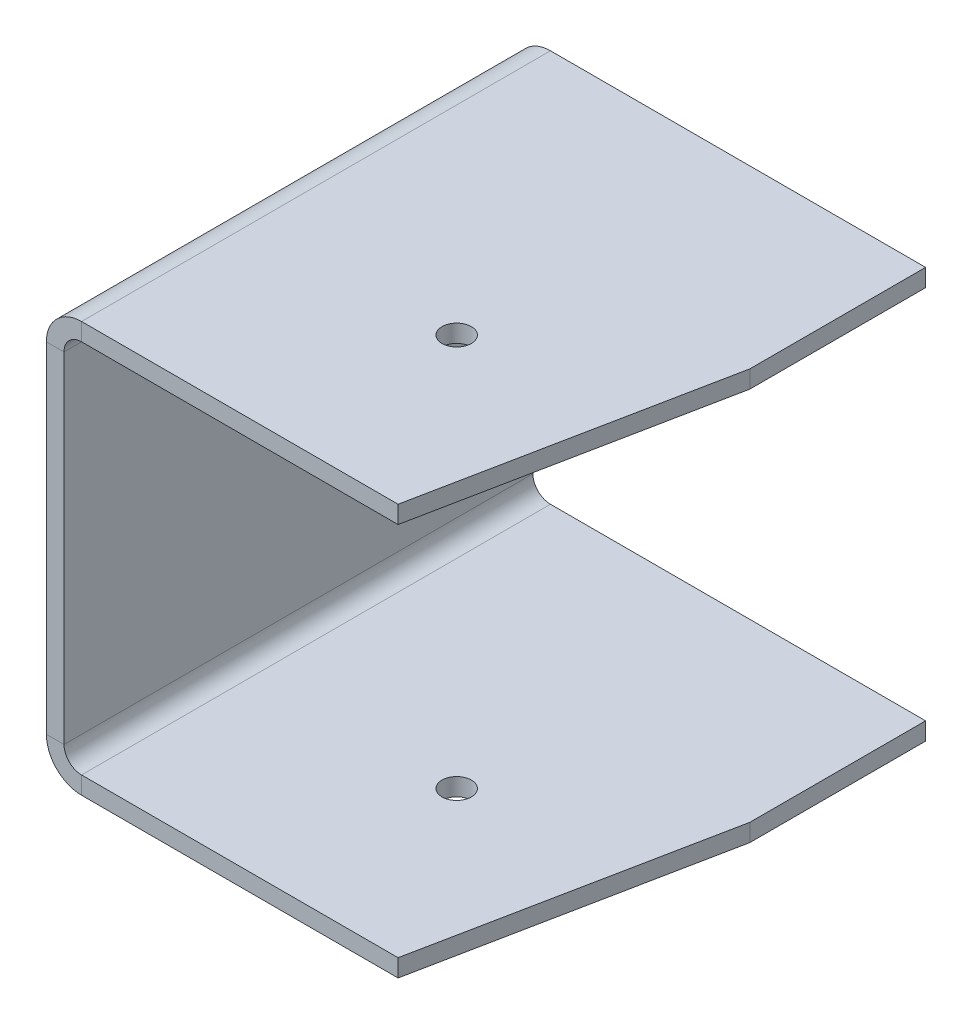
ISO-10303-21;
HEADER;
FILE_DESCRIPTION(('STEP AP214'),'2;1');
FILE_NAME('part.step','',(''),(''),'','','');
FILE_SCHEMA(('AUTOMOTIVE_DESIGN { 1 0 10303 214 1 1 1 1 }'));
ENDSEC;
DATA;
#1=APPLICATION_CONTEXT('core data for automotive mechanical design processes');
#2=APPLICATION_PROTOCOL_DEFINITION('international standard','automotive_design',2000,#1);
#3=PRODUCT_CONTEXT('',#1,'mechanical');
#4=PRODUCT('Part','Part','',(#3));
#5=PRODUCT_RELATED_PRODUCT_CATEGORY('part','',(#4));
#6=PRODUCT_DEFINITION_FORMATION('','',#4);
#7=PRODUCT_DEFINITION_CONTEXT('part definition',#1,'design');
#8=PRODUCT_DEFINITION('design','',#6,#7);
#9=PRODUCT_DEFINITION_SHAPE('','',#8);
#10=(LENGTH_UNIT() NAMED_UNIT(*) SI_UNIT(.MILLI.,.METRE.));
#11=(NAMED_UNIT(*) PLANE_ANGLE_UNIT() SI_UNIT($,.RADIAN.));
#12=(NAMED_UNIT(*) SI_UNIT($,.STERADIAN.) SOLID_ANGLE_UNIT());
#13=UNCERTAINTY_MEASURE_WITH_UNIT(LENGTH_MEASURE(1.E-05),#10,'distance_accuracy_value','');
#14=(GEOMETRIC_REPRESENTATION_CONTEXT(3) GLOBAL_UNCERTAINTY_ASSIGNED_CONTEXT((#13)) GLOBAL_UNIT_ASSIGNED_CONTEXT((#10,
#11,#12)) REPRESENTATION_CONTEXT('',''));
#15=CARTESIAN_POINT('',(0.,0.,0.));
#16=DIRECTION('',(0.,0.,1.));
#17=DIRECTION('',(1.,0.,0.));
#18=AXIS2_PLACEMENT_3D('',#15,#16,#17);
#19=CARTESIAN_POINT('',(-70.,6.,80.));
#20=DIRECTION('',(0.,0.,1.));
#21=DIRECTION('',(1.,0.,0.));
#22=AXIS2_PLACEMENT_3D('',#19,#20,#21);
#23=PLANE('',#22);
#24=DIRECTION('',(1.,0.,0.));
#25=VECTOR('',#24,1.);
#26=CARTESIAN_POINT('',(-70.,6.,80.));
#27=LINE('',#26,#25);
#28=CARTESIAN_POINT('',(-70.,6.,80.));
#29=VERTEX_POINT('',#28);
#30=CARTESIAN_POINT('',(-67.,6.,80.));
#31=VERTEX_POINT('',#30);
#32=EDGE_CURVE('E49',#29,#31,#27,.T.);
#33=ORIENTED_EDGE('',*,*,#32,.F.);
#34=CARTESIAN_POINT('',(-64.,6.,80.));
#35=DIRECTION('',(0.,0.,1.));
#36=DIRECTION('',(1.,0.,0.));
#37=AXIS2_PLACEMENT_3D('',#34,#35,#36);
#38=CIRCLE('',#37,6.);
#39=CARTESIAN_POINT('',(-64.,0.,80.));
#40=VERTEX_POINT('',#39);
#41=EDGE_CURVE('E161',#40,#29,#38,.F.);
#42=ORIENTED_EDGE('',*,*,#41,.F.);
#43=DIRECTION('',(0.,-1.,0.));
#44=VECTOR('',#43,1.);
#45=CARTESIAN_POINT('',(-64.,3.,80.));
#46=LINE('',#45,#44);
#47=CARTESIAN_POINT('',(-64.,3.,80.));
#48=VERTEX_POINT('',#47);
#49=EDGE_CURVE('E158',#48,#40,#46,.T.);
#50=ORIENTED_EDGE('',*,*,#49,.F.);
#51=CARTESIAN_POINT('',(-64.,6.,80.));
#52=DIRECTION('',(0.,0.,1.));
#53=DIRECTION('',(1.,0.,0.));
#54=AXIS2_PLACEMENT_3D('',#51,#52,#53);
#55=CIRCLE('',#54,3.);
#56=EDGE_CURVE('E163',#48,#31,#55,.F.);
#57=ORIENTED_EDGE('',*,*,#56,.T.);
#58=EDGE_LOOP('',(#33,#42,#50,#57));
#59=FACE_BOUND('',#58,.T.);
#60=ADVANCED_FACE('F41',(#59),#23,.T.);
#61=CARTESIAN_POINT('',(-64.,3.,80.));
#62=DIRECTION('',(0.,0.,1.));
#63=DIRECTION('',(1.,0.,0.));
#64=AXIS2_PLACEMENT_3D('',#61,#62,#63);
#65=PLANE('',#64);
#66=DIRECTION('',(0.,1.,0.));
#67=VECTOR('',#66,1.);
#68=CARTESIAN_POINT('',(-70.,0.,80.));
#69=LINE('',#68,#67);
#70=CARTESIAN_POINT('',(-70.,64.,80.));
#71=VERTEX_POINT('',#70);
#72=EDGE_CURVE('E166',#29,#71,#69,.T.);
#73=ORIENTED_EDGE('',*,*,#72,.F.);
#74=ORIENTED_EDGE('',*,*,#32,.T.);
#75=DIRECTION('',(0.,1.,0.));
#76=VECTOR('',#75,1.);
#77=CARTESIAN_POINT('',(-67.,0.,80.));
#78=LINE('',#77,#76);
#79=CARTESIAN_POINT('',(-67.,64.,80.));
#80=VERTEX_POINT('',#79);
#81=EDGE_CURVE('E172',#31,#80,#78,.T.);
#82=ORIENTED_EDGE('',*,*,#81,.T.);
#83=DIRECTION('',(-1.,0.,0.));
#84=VECTOR('',#83,1.);
#85=CARTESIAN_POINT('',(-67.,64.,80.));
#86=LINE('',#85,#84);
#87=EDGE_CURVE('E250',#80,#71,#86,.T.);
#88=ORIENTED_EDGE('',*,*,#87,.T.);
#89=EDGE_LOOP('',(#73,#74,#82,#88));
#90=FACE_BOUND('',#89,.T.);
#91=ADVANCED_FACE('F261',(#90),#65,.T.);
#92=CARTESIAN_POINT('',(-64.,0.,0.));
#93=DIRECTION('',(0.,0.,-1.));
#94=DIRECTION('',(-1.,0.,0.));
#95=AXIS2_PLACEMENT_3D('',#92,#93,#94);
#96=PLANE('',#95);
#97=DIRECTION('',(0.,1.,0.));
#98=VECTOR('',#97,1.);
#99=CARTESIAN_POINT('',(-64.,0.,0.));
#100=LINE('',#99,#98);
#101=CARTESIAN_POINT('',(-64.,0.,0.));
#102=VERTEX_POINT('',#101);
#103=CARTESIAN_POINT('',(-64.,3.,0.));
#104=VERTEX_POINT('',#103);
#105=EDGE_CURVE('E256',#102,#104,#100,.T.);
#106=ORIENTED_EDGE('',*,*,#105,.F.);
#107=CARTESIAN_POINT('',(-64.,6.,0.));
#108=DIRECTION('',(0.,0.,1.));
#109=DIRECTION('',(1.,0.,0.));
#110=AXIS2_PLACEMENT_3D('',#107,#108,#109);
#111=CIRCLE('',#110,6.);
#112=CARTESIAN_POINT('',(-70.,6.,0.));
#113=VERTEX_POINT('',#112);
#114=EDGE_CURVE('E195',#102,#113,#111,.F.);
#115=ORIENTED_EDGE('',*,*,#114,.T.);
#116=DIRECTION('',(-1.,0.,0.));
#117=VECTOR('',#116,1.);
#118=CARTESIAN_POINT('',(-67.,6.,0.));
#119=LINE('',#118,#117);
#120=CARTESIAN_POINT('',(-67.,6.,0.));
#121=VERTEX_POINT('',#120);
#122=EDGE_CURVE('E254',#121,#113,#119,.T.);
#123=ORIENTED_EDGE('',*,*,#122,.F.);
#124=CARTESIAN_POINT('',(-64.,6.,0.));
#125=DIRECTION('',(0.,0.,1.));
#126=DIRECTION('',(1.,0.,0.));
#127=AXIS2_PLACEMENT_3D('',#124,#125,#126);
#128=CIRCLE('',#127,3.);
#129=EDGE_CURVE('E207',#104,#121,#128,.F.);
#130=ORIENTED_EDGE('',*,*,#129,.F.);
#131=EDGE_LOOP('',(#106,#115,#123,#130));
#132=FACE_BOUND('',#131,.T.);
#133=ADVANCED_FACE('F341',(#132),#96,.T.);
#134=CARTESIAN_POINT('',(-67.,6.,0.));
#135=DIRECTION('',(0.,0.,-1.));
#136=DIRECTION('',(-1.,0.,0.));
#137=AXIS2_PLACEMENT_3D('',#134,#135,#136);
#138=PLANE('',#137);
#139=DIRECTION('',(-1.,0.,0.));
#140=VECTOR('',#139,1.);
#141=CARTESIAN_POINT('',(0.,0.,0.));
#142=LINE('',#141,#140);
#143=CARTESIAN_POINT('',(0.,0.,0.));
#144=VERTEX_POINT('',#143);
#145=EDGE_CURVE('E198',#144,#102,#142,.T.);
#146=ORIENTED_EDGE('',*,*,#145,.T.);
#147=ORIENTED_EDGE('',*,*,#105,.T.);
#148=DIRECTION('',(1.,0.,0.));
#149=VECTOR('',#148,1.);
#150=CARTESIAN_POINT('',(0.,3.,0.));
#151=LINE('',#150,#149);
#152=CARTESIAN_POINT('',(0.,3.,0.));
#153=VERTEX_POINT('',#152);
#154=EDGE_CURVE('E204',#153,#104,#151,.F.);
#155=ORIENTED_EDGE('',*,*,#154,.F.);
#156=DIRECTION('',(0.,-1.,0.));
#157=VECTOR('',#156,1.);
#158=CARTESIAN_POINT('',(0.,3.,0.));
#159=LINE('',#158,#157);
#160=EDGE_CURVE('E201',#153,#144,#159,.T.);
#161=ORIENTED_EDGE('',*,*,#160,.T.);
#162=EDGE_LOOP('',(#146,#147,#155,#161));
#163=FACE_BOUND('',#162,.T.);
#164=ADVANCED_FACE('F345',(#163),#138,.T.);
#165=CARTESIAN_POINT('',(-64.,70.,80.));
#166=DIRECTION('',(0.,0.,1.));
#167=DIRECTION('',(1.,0.,0.));
#168=AXIS2_PLACEMENT_3D('',#165,#166,#167);
#169=PLANE('',#168);
#170=DIRECTION('',(0.,-1.,0.));
#171=VECTOR('',#170,1.);
#172=CARTESIAN_POINT('',(-64.,70.,80.));
#173=LINE('',#172,#171);
#174=CARTESIAN_POINT('',(-64.,70.,80.));
#175=VERTEX_POINT('',#174);
#176=CARTESIAN_POINT('',(-64.,67.,80.));
#177=VERTEX_POINT('',#176);
#178=EDGE_CURVE('E252',#175,#177,#173,.T.);
#179=ORIENTED_EDGE('',*,*,#178,.F.);
#180=CARTESIAN_POINT('',(-64.,64.,80.));
#181=DIRECTION('',(0.,0.,1.));
#182=DIRECTION('',(1.,0.,0.));
#183=AXIS2_PLACEMENT_3D('',#180,#181,#182);
#184=CIRCLE('',#183,6.);
#185=EDGE_CURVE('E288',#71,#175,#184,.F.);
#186=ORIENTED_EDGE('',*,*,#185,.F.);
#187=ORIENTED_EDGE('',*,*,#87,.F.);
#188=CARTESIAN_POINT('',(-64.,64.,80.));
#189=DIRECTION('',(0.,0.,1.));
#190=DIRECTION('',(1.,0.,0.));
#191=AXIS2_PLACEMENT_3D('',#188,#189,#190);
#192=CIRCLE('',#191,3.);
#193=EDGE_CURVE('E175',#80,#177,#192,.F.);
#194=ORIENTED_EDGE('',*,*,#193,.T.);
#195=EDGE_LOOP('',(#179,#186,#187,#194));
#196=FACE_BOUND('',#195,.T.);
#197=ADVANCED_FACE('F284',(#196),#169,.T.);
#198=CARTESIAN_POINT('',(-67.,64.,80.));
#199=DIRECTION('',(0.,0.,1.));
#200=DIRECTION('',(1.,0.,0.));
#201=AXIS2_PLACEMENT_3D('',#198,#199,#200);
#202=PLANE('',#201);
#203=DIRECTION('',(0.,-1.,0.));
#204=VECTOR('',#203,1.);
#205=CARTESIAN_POINT('',(-10.,158.,80.));
#206=LINE('',#205,#204);
#207=CARTESIAN_POINT('',(-10.,70.,80.));
#208=VERTEX_POINT('',#207);
#209=CARTESIAN_POINT('',(-10.,67.,80.));
#210=VERTEX_POINT('',#209);
#211=EDGE_CURVE('E153',#208,#210,#206,.T.);
#212=ORIENTED_EDGE('',*,*,#211,.F.);
#213=DIRECTION('',(1.,0.,0.));
#214=VECTOR('',#213,1.);
#215=CARTESIAN_POINT('',(-70.,70.,80.));
#216=LINE('',#215,#214);
#217=EDGE_CURVE('E296',#175,#208,#216,.T.);
#218=ORIENTED_EDGE('',*,*,#217,.F.);
#219=ORIENTED_EDGE('',*,*,#178,.T.);
#220=DIRECTION('',(1.,0.,0.));
#221=VECTOR('',#220,1.);
#222=CARTESIAN_POINT('',(-70.,67.,80.));
#223=LINE('',#222,#221);
#224=EDGE_CURVE('E216',#177,#210,#223,.T.);
#225=ORIENTED_EDGE('',*,*,#224,.T.);
#226=EDGE_LOOP('',(#212,#218,#219,#225));
#227=FACE_BOUND('',#226,.T.);
#228=ADVANCED_FACE('F354',(#227),#202,.T.);
#229=CARTESIAN_POINT('',(-70.,64.,0.));
#230=DIRECTION('',(0.,0.,-1.));
#231=DIRECTION('',(-1.,0.,0.));
#232=AXIS2_PLACEMENT_3D('',#229,#230,#231);
#233=PLANE('',#232);
#234=DIRECTION('',(1.,0.,0.));
#235=VECTOR('',#234,1.);
#236=CARTESIAN_POINT('',(-70.,64.,0.));
#237=LINE('',#236,#235);
#238=CARTESIAN_POINT('',(-70.,64.,0.));
#239=VERTEX_POINT('',#238);
#240=CARTESIAN_POINT('',(-67.,64.,0.));
#241=VERTEX_POINT('',#240);
#242=EDGE_CURVE('E248',#239,#241,#237,.T.);
#243=ORIENTED_EDGE('',*,*,#242,.F.);
#244=CARTESIAN_POINT('',(-64.,64.,0.));
#245=DIRECTION('',(0.,0.,1.));
#246=DIRECTION('',(1.,0.,0.));
#247=AXIS2_PLACEMENT_3D('',#244,#245,#246);
#248=CIRCLE('',#247,6.);
#249=CARTESIAN_POINT('',(-64.,70.,0.));
#250=VERTEX_POINT('',#249);
#251=EDGE_CURVE('E189',#239,#250,#248,.F.);
#252=ORIENTED_EDGE('',*,*,#251,.T.);
#253=DIRECTION('',(0.,1.,0.));
#254=VECTOR('',#253,1.);
#255=CARTESIAN_POINT('',(-64.,67.,0.));
#256=LINE('',#255,#254);
#257=CARTESIAN_POINT('',(-64.,67.,0.));
#258=VERTEX_POINT('',#257);
#259=EDGE_CURVE('E246',#258,#250,#256,.T.);
#260=ORIENTED_EDGE('',*,*,#259,.F.);
#261=CARTESIAN_POINT('',(-64.,64.,0.));
#262=DIRECTION('',(0.,0.,1.));
#263=DIRECTION('',(1.,0.,0.));
#264=AXIS2_PLACEMENT_3D('',#261,#262,#263);
#265=CIRCLE('',#264,3.);
#266=EDGE_CURVE('E213',#241,#258,#265,.F.);
#267=ORIENTED_EDGE('',*,*,#266,.F.);
#268=EDGE_LOOP('',(#243,#252,#260,#267));
#269=FACE_BOUND('',#268,.T.);
#270=ADVANCED_FACE('F357',(#269),#233,.T.);
#271=CARTESIAN_POINT('',(-64.,67.,0.));
#272=DIRECTION('',(0.,0.,-1.));
#273=DIRECTION('',(-1.,0.,0.));
#274=AXIS2_PLACEMENT_3D('',#271,#272,#273);
#275=PLANE('',#274);
#276=DIRECTION('',(0.,1.,0.));
#277=VECTOR('',#276,1.);
#278=CARTESIAN_POINT('',(-70.,0.,0.));
#279=LINE('',#278,#277);
#280=EDGE_CURVE('E192',#113,#239,#279,.T.);
#281=ORIENTED_EDGE('',*,*,#280,.T.);
#282=ORIENTED_EDGE('',*,*,#242,.T.);
#283=DIRECTION('',(0.,1.,0.));
#284=VECTOR('',#283,1.);
#285=CARTESIAN_POINT('',(-67.,0.,0.));
#286=LINE('',#285,#284);
#287=EDGE_CURVE('E210',#121,#241,#286,.T.);
#288=ORIENTED_EDGE('',*,*,#287,.F.);
#289=ORIENTED_EDGE('',*,*,#122,.T.);
#290=EDGE_LOOP('',(#281,#282,#288,#289));
#291=FACE_BOUND('',#290,.T.);
#292=ADVANCED_FACE('F361',(#291),#275,.T.);
#293=CARTESIAN_POINT('',(-70.,67.,80.));
#294=DIRECTION('',(0.,1.,0.));
#295=DIRECTION('',(0.,0.,1.));
#296=AXIS2_PLACEMENT_3D('',#293,#294,#295);
#297=PLANE('',#296);
#298=CARTESIAN_POINT('',(-30.,67.,50.));
#299=DIRECTION('',(0.,1.,0.));
#300=DIRECTION('',(0.,0.,1.));
#301=AXIS2_PLACEMENT_3D('',#298,#299,#300);
#302=CIRCLE('',#301,2.5);
#303=CARTESIAN_POINT('',(-30.,67.,52.5));
#304=VERTEX_POINT('',#303);
#305=EDGE_CURVE('E154',#304,#304,#302,.T.);
#306=ORIENTED_EDGE('',*,*,#305,.T.);
#307=EDGE_LOOP('',(#306));
#308=FACE_BOUND('',#307,.T.);
#309=DIRECTION('',(0.,0.,-1.));
#310=VECTOR('',#309,1.);
#311=CARTESIAN_POINT('',(0.,67.,80.));
#312=LINE('',#311,#310);
#313=CARTESIAN_POINT('',(0.,67.,30.));
#314=VERTEX_POINT('',#313);
#315=CARTESIAN_POINT('',(0.,67.,0.));
#316=VERTEX_POINT('',#315);
#317=EDGE_CURVE('E244',#314,#316,#312,.T.);
#318=ORIENTED_EDGE('',*,*,#317,.F.);
#319=DIRECTION('',(-0.196116135138184,0.,0.98058067569092));
#320=VECTOR('',#319,1.);
#321=CARTESIAN_POINT('',(-12.3076923076923,67.,91.5384615384615));
#322=LINE('',#321,#320);
#323=EDGE_CURVE('E183',#314,#210,#322,.T.);
#324=ORIENTED_EDGE('',*,*,#323,.T.);
#325=ORIENTED_EDGE('',*,*,#224,.F.);
#326=DIRECTION('',(0.,0.,-1.));
#327=VECTOR('',#326,1.);
#328=CARTESIAN_POINT('',(-64.,67.,80.));
#329=LINE('',#328,#327);
#330=EDGE_CURVE('E178',#177,#258,#329,.T.);
#331=ORIENTED_EDGE('',*,*,#330,.T.);
#332=DIRECTION('',(1.,0.,0.));
#333=VECTOR('',#332,1.);
#334=CARTESIAN_POINT('',(-70.,67.,0.));
#335=LINE('',#334,#333);
#336=EDGE_CURVE('E179',#258,#316,#335,.T.);
#337=ORIENTED_EDGE('',*,*,#336,.T.);
#338=EDGE_LOOP('',(#318,#324,#325,#331,#337));
#339=FACE_BOUND('',#338,.T.);
#340=ADVANCED_FACE('F365',(#308,#339),#297,.F.);
#341=CARTESIAN_POINT('',(0.,70.,80.));
#342=DIRECTION('',(1.,0.,0.));
#343=DIRECTION('',(0.,0.,-1.));
#344=AXIS2_PLACEMENT_3D('',#341,#342,#343);
#345=PLANE('',#344);
#346=DIRECTION('',(0.,-1.,0.));
#347=VECTOR('',#346,1.);
#348=CARTESIAN_POINT('',(0.,158.,30.));
#349=LINE('',#348,#347);
#350=CARTESIAN_POINT('',(0.,70.,29.9999999999999));
#351=VERTEX_POINT('',#350);
#352=EDGE_CURVE('E56',#351,#314,#349,.T.);
#353=ORIENTED_EDGE('',*,*,#352,.T.);
#354=ORIENTED_EDGE('',*,*,#317,.T.);
#355=DIRECTION('',(0.,-1.,0.));
#356=VECTOR('',#355,1.);
#357=CARTESIAN_POINT('',(0.,70.,0.));
#358=LINE('',#357,#356);
#359=CARTESIAN_POINT('',(0.,70.,0.));
#360=VERTEX_POINT('',#359);
#361=EDGE_CURVE('E182',#360,#316,#358,.T.);
#362=ORIENTED_EDGE('',*,*,#361,.F.);
#363=DIRECTION('',(0.,0.,-1.));
#364=VECTOR('',#363,1.);
#365=CARTESIAN_POINT('',(0.,70.,80.));
#366=LINE('',#365,#364);
#367=EDGE_CURVE('E242',#351,#360,#366,.T.);
#368=ORIENTED_EDGE('',*,*,#367,.F.);
#369=EDGE_LOOP('',(#353,#354,#362,#368));
#370=FACE_BOUND('',#369,.T.);
#371=ADVANCED_FACE('F369',(#370),#345,.T.);
#372=CARTESIAN_POINT('',(-70.,70.,80.));
#373=DIRECTION('',(0.,1.,0.));
#374=DIRECTION('',(0.,0.,1.));
#375=AXIS2_PLACEMENT_3D('',#372,#373,#374);
#376=PLANE('',#375);
#377=CARTESIAN_POINT('',(-30.,70.,50.));
#378=DIRECTION('',(0.,1.,0.));
#379=DIRECTION('',(0.,0.,1.));
#380=AXIS2_PLACEMENT_3D('',#377,#378,#379);
#381=CIRCLE('',#380,2.5);
#382=CARTESIAN_POINT('',(-30.,70.,52.5));
#383=VERTEX_POINT('',#382);
#384=EDGE_CURVE('E313',#383,#383,#381,.T.);
#385=ORIENTED_EDGE('',*,*,#384,.F.);
#386=EDGE_LOOP('',(#385));
#387=FACE_BOUND('',#386,.T.);
#388=DIRECTION('',(-0.196116135138184,0.,0.98058067569092));
#389=VECTOR('',#388,1.);
#390=CARTESIAN_POINT('',(-12.3076923076923,70.,91.5384615384615));
#391=LINE('',#390,#389);
#392=EDGE_CURVE('E305',#351,#208,#391,.T.);
#393=ORIENTED_EDGE('',*,*,#392,.F.);
#394=ORIENTED_EDGE('',*,*,#367,.T.);
#395=DIRECTION('',(1.,0.,0.));
#396=VECTOR('',#395,1.);
#397=CARTESIAN_POINT('',(-70.,70.,0.));
#398=LINE('',#397,#396);
#399=EDGE_CURVE('E186',#250,#360,#398,.T.);
#400=ORIENTED_EDGE('',*,*,#399,.F.);
#401=DIRECTION('',(0.,0.,-1.));
#402=VECTOR('',#401,1.);
#403=CARTESIAN_POINT('',(-64.,70.,80.));
#404=LINE('',#403,#402);
#405=EDGE_CURVE('E239',#175,#250,#404,.T.);
#406=ORIENTED_EDGE('',*,*,#405,.F.);
#407=ORIENTED_EDGE('',*,*,#217,.T.);
#408=EDGE_LOOP('',(#393,#394,#400,#406,#407));
#409=FACE_BOUND('',#408,.T.);
#410=ADVANCED_FACE('F373',(#387,#409),#376,.T.);
#411=CARTESIAN_POINT('',(-64.,64.,80.));
#412=DIRECTION('',(0.,0.,-1.));
#413=DIRECTION('',(-1.,0.,0.));
#414=AXIS2_PLACEMENT_3D('',#411,#412,#413);
#415=CYLINDRICAL_SURFACE('',#414,6.);
#416=ORIENTED_EDGE('',*,*,#251,.F.);
#417=DIRECTION('',(0.,0.,-1.));
#418=VECTOR('',#417,1.);
#419=CARTESIAN_POINT('',(-70.,64.,80.));
#420=LINE('',#419,#418);
#421=EDGE_CURVE('E236',#71,#239,#420,.T.);
#422=ORIENTED_EDGE('',*,*,#421,.F.);
#423=ORIENTED_EDGE('',*,*,#185,.T.);
#424=ORIENTED_EDGE('',*,*,#405,.T.);
#425=EDGE_LOOP('',(#416,#422,#423,#424));
#426=FACE_BOUND('',#425,.T.);
#427=ADVANCED_FACE('F292',(#426),#415,.T.);
#428=CARTESIAN_POINT('',(-70.,0.,80.));
#429=DIRECTION('',(-1.,0.,0.));
#430=DIRECTION('',(0.,0.,1.));
#431=AXIS2_PLACEMENT_3D('',#428,#429,#430);
#432=PLANE('',#431);
#433=ORIENTED_EDGE('',*,*,#280,.F.);
#434=DIRECTION('',(0.,0.,-1.));
#435=VECTOR('',#434,1.);
#436=CARTESIAN_POINT('',(-70.,6.,80.));
#437=LINE('',#436,#435);
#438=EDGE_CURVE('E233',#29,#113,#437,.T.);
#439=ORIENTED_EDGE('',*,*,#438,.F.);
#440=ORIENTED_EDGE('',*,*,#72,.T.);
#441=ORIENTED_EDGE('',*,*,#421,.T.);
#442=EDGE_LOOP('',(#433,#439,#440,#441));
#443=FACE_BOUND('',#442,.T.);
#444=ADVANCED_FACE('F295',(#443),#432,.T.);
#445=CARTESIAN_POINT('',(-64.,6.,80.));
#446=DIRECTION('',(0.,0.,-1.));
#447=DIRECTION('',(-1.,0.,0.));
#448=AXIS2_PLACEMENT_3D('',#445,#446,#447);
#449=CYLINDRICAL_SURFACE('',#448,6.);
#450=ORIENTED_EDGE('',*,*,#114,.F.);
#451=DIRECTION('',(0.,0.,-1.));
#452=VECTOR('',#451,1.);
#453=CARTESIAN_POINT('',(-64.,0.,80.));
#454=LINE('',#453,#452);
#455=EDGE_CURVE('E231',#40,#102,#454,.T.);
#456=ORIENTED_EDGE('',*,*,#455,.F.);
#457=ORIENTED_EDGE('',*,*,#41,.T.);
#458=ORIENTED_EDGE('',*,*,#438,.T.);
#459=EDGE_LOOP('',(#450,#456,#457,#458));
#460=FACE_BOUND('',#459,.T.);
#461=ADVANCED_FACE('F382',(#460),#449,.T.);
#462=CARTESIAN_POINT('',(0.,0.,80.));
#463=DIRECTION('',(0.,-1.,0.));
#464=DIRECTION('',(0.,0.,-1.));
#465=AXIS2_PLACEMENT_3D('',#462,#463,#464);
#466=PLANE('',#465);
#467=CARTESIAN_POINT('',(-30.,0.,50.));
#468=DIRECTION('',(0.,-1.,0.));
#469=DIRECTION('',(0.,0.,-1.));
#470=AXIS2_PLACEMENT_3D('',#467,#468,#469);
#471=CIRCLE('',#470,2.5);
#472=CARTESIAN_POINT('',(-30.,0.,47.5));
#473=VERTEX_POINT('',#472);
#474=EDGE_CURVE('E316',#473,#473,#471,.T.);
#475=ORIENTED_EDGE('',*,*,#474,.F.);
#476=EDGE_LOOP('',(#475));
#477=FACE_BOUND('',#476,.T.);
#478=DIRECTION('',(0.196116135138184,0.,-0.98058067569092));
#479=VECTOR('',#478,1.);
#480=CARTESIAN_POINT('',(5.76923076923077,0.,1.15384615384615));
#481=LINE('',#480,#479);
#482=CARTESIAN_POINT('',(-10.,0.,80.));
#483=VERTEX_POINT('',#482);
#484=CARTESIAN_POINT('',(0.,0.,30.));
#485=VERTEX_POINT('',#484);
#486=EDGE_CURVE('E140',#483,#485,#481,.T.);
#487=ORIENTED_EDGE('',*,*,#486,.F.);
#488=DIRECTION('',(-1.,0.,0.));
#489=VECTOR('',#488,1.);
#490=CARTESIAN_POINT('',(0.,0.,80.));
#491=LINE('',#490,#489);
#492=EDGE_CURVE('E149',#483,#40,#491,.T.);
#493=ORIENTED_EDGE('',*,*,#492,.T.);
#494=ORIENTED_EDGE('',*,*,#455,.T.);
#495=ORIENTED_EDGE('',*,*,#145,.F.);
#496=DIRECTION('',(0.,0.,-1.));
#497=VECTOR('',#496,1.);
#498=CARTESIAN_POINT('',(0.,0.,80.));
#499=LINE('',#498,#497);
#500=EDGE_CURVE('E152',#485,#144,#499,.T.);
#501=ORIENTED_EDGE('',*,*,#500,.F.);
#502=EDGE_LOOP('',(#487,#493,#494,#495,#501));
#503=FACE_BOUND('',#502,.T.);
#504=ADVANCED_FACE('F147',(#477,#503),#466,.T.);
#505=CARTESIAN_POINT('',(0.,3.,80.));
#506=DIRECTION('',(1.,0.,0.));
#507=DIRECTION('',(0.,0.,-1.));
#508=AXIS2_PLACEMENT_3D('',#505,#506,#507);
#509=PLANE('',#508);
#510=CARTESIAN_POINT('',(0.,3.,30.));
#511=VERTEX_POINT('',#510);
#512=EDGE_CURVE('E309',#511,#485,#349,.T.);
#513=ORIENTED_EDGE('',*,*,#512,.T.);
#514=ORIENTED_EDGE('',*,*,#500,.T.);
#515=ORIENTED_EDGE('',*,*,#160,.F.);
#516=DIRECTION('',(0.,0.,-1.));
#517=VECTOR('',#516,1.);
#518=CARTESIAN_POINT('',(0.,3.,80.));
#519=LINE('',#518,#517);
#520=EDGE_CURVE('E228',#511,#153,#519,.T.);
#521=ORIENTED_EDGE('',*,*,#520,.F.);
#522=EDGE_LOOP('',(#513,#514,#515,#521));
#523=FACE_BOUND('',#522,.T.);
#524=ADVANCED_FACE('F388',(#523),#509,.T.);
#525=CARTESIAN_POINT('',(0.,3.,80.));
#526=DIRECTION('',(0.,-1.,0.));
#527=DIRECTION('',(0.,0.,-1.));
#528=AXIS2_PLACEMENT_3D('',#525,#526,#527);
#529=PLANE('',#528);
#530=CARTESIAN_POINT('',(-30.,3.,50.));
#531=DIRECTION('',(0.,-1.,0.));
#532=DIRECTION('',(0.,0.,-1.));
#533=AXIS2_PLACEMENT_3D('',#530,#531,#532);
#534=CIRCLE('',#533,2.5);
#535=CARTESIAN_POINT('',(-30.,3.,47.5));
#536=VERTEX_POINT('',#535);
#537=EDGE_CURVE('E44',#536,#536,#534,.T.);
#538=ORIENTED_EDGE('',*,*,#537,.T.);
#539=EDGE_LOOP('',(#538));
#540=FACE_BOUND('',#539,.T.);
#541=DIRECTION('',(1.,0.,0.));
#542=VECTOR('',#541,1.);
#543=CARTESIAN_POINT('',(0.,3.,80.));
#544=LINE('',#543,#542);
#545=CARTESIAN_POINT('',(-10.,3.,80.));
#546=VERTEX_POINT('',#545);
#547=EDGE_CURVE('E160',#546,#48,#544,.F.);
#548=ORIENTED_EDGE('',*,*,#547,.F.);
#549=DIRECTION('',(0.196116135138184,0.,-0.98058067569092));
#550=VECTOR('',#549,1.);
#551=CARTESIAN_POINT('',(-9.61538461538462,3.,78.0769230769231));
#552=LINE('',#551,#550);
#553=EDGE_CURVE('E63',#546,#511,#552,.T.);
#554=ORIENTED_EDGE('',*,*,#553,.T.);
#555=ORIENTED_EDGE('',*,*,#520,.T.);
#556=ORIENTED_EDGE('',*,*,#154,.T.);
#557=DIRECTION('',(0.,0.,-1.));
#558=VECTOR('',#557,1.);
#559=CARTESIAN_POINT('',(-64.,3.,80.));
#560=LINE('',#559,#558);
#561=EDGE_CURVE('E225',#48,#104,#560,.T.);
#562=ORIENTED_EDGE('',*,*,#561,.F.);
#563=EDGE_LOOP('',(#548,#554,#555,#556,#562));
#564=FACE_BOUND('',#563,.T.);
#565=ADVANCED_FACE('F323',(#540,#564),#529,.F.);
#566=CARTESIAN_POINT('',(-64.,6.,80.));
#567=DIRECTION('',(0.,0.,-1.));
#568=DIRECTION('',(-1.,0.,0.));
#569=AXIS2_PLACEMENT_3D('',#566,#567,#568);
#570=CYLINDRICAL_SURFACE('',#569,3.);
#571=ORIENTED_EDGE('',*,*,#129,.T.);
#572=DIRECTION('',(0.,0.,-1.));
#573=VECTOR('',#572,1.);
#574=CARTESIAN_POINT('',(-67.,6.,80.));
#575=LINE('',#574,#573);
#576=EDGE_CURVE('E222',#31,#121,#575,.T.);
#577=ORIENTED_EDGE('',*,*,#576,.F.);
#578=ORIENTED_EDGE('',*,*,#56,.F.);
#579=ORIENTED_EDGE('',*,*,#561,.T.);
#580=EDGE_LOOP('',(#571,#577,#578,#579));
#581=FACE_BOUND('',#580,.T.);
#582=ADVANCED_FACE('F272',(#581),#570,.F.);
#583=CARTESIAN_POINT('',(-67.,0.,80.));
#584=DIRECTION('',(-1.,0.,0.));
#585=DIRECTION('',(0.,0.,1.));
#586=AXIS2_PLACEMENT_3D('',#583,#584,#585);
#587=PLANE('',#586);
#588=ORIENTED_EDGE('',*,*,#287,.T.);
#589=DIRECTION('',(0.,0.,-1.));
#590=VECTOR('',#589,1.);
#591=CARTESIAN_POINT('',(-67.,64.,80.));
#592=LINE('',#591,#590);
#593=EDGE_CURVE('E219',#80,#241,#592,.T.);
#594=ORIENTED_EDGE('',*,*,#593,.F.);
#595=ORIENTED_EDGE('',*,*,#81,.F.);
#596=ORIENTED_EDGE('',*,*,#576,.T.);
#597=EDGE_LOOP('',(#588,#594,#595,#596));
#598=FACE_BOUND('',#597,.T.);
#599=ADVANCED_FACE('F276',(#598),#587,.F.);
#600=CARTESIAN_POINT('',(-64.,64.,80.));
#601=DIRECTION('',(0.,0.,-1.));
#602=DIRECTION('',(-1.,0.,0.));
#603=AXIS2_PLACEMENT_3D('',#600,#601,#602);
#604=CYLINDRICAL_SURFACE('',#603,3.);
#605=ORIENTED_EDGE('',*,*,#266,.T.);
#606=ORIENTED_EDGE('',*,*,#330,.F.);
#607=ORIENTED_EDGE('',*,*,#193,.F.);
#608=ORIENTED_EDGE('',*,*,#593,.T.);
#609=EDGE_LOOP('',(#605,#606,#607,#608));
#610=FACE_BOUND('',#609,.T.);
#611=ADVANCED_FACE('F281',(#610),#604,.F.);
#612=CARTESIAN_POINT('',(-64.,64.,80.));
#613=DIRECTION('',(0.,0.,1.));
#614=DIRECTION('',(1.,0.,0.));
#615=AXIS2_PLACEMENT_3D('',#612,#613,#614);
#616=PLANE('',#615);
#617=DIRECTION('',(0.,-1.,0.));
#618=VECTOR('',#617,1.);
#619=CARTESIAN_POINT('',(-10.,64.,80.));
#620=LINE('',#619,#618);
#621=EDGE_CURVE('E11',#546,#483,#620,.T.);
#622=ORIENTED_EDGE('',*,*,#621,.F.);
#623=ORIENTED_EDGE('',*,*,#547,.T.);
#624=ORIENTED_EDGE('',*,*,#49,.T.);
#625=ORIENTED_EDGE('',*,*,#492,.F.);
#626=EDGE_LOOP('',(#622,#623,#624,#625));
#627=FACE_BOUND('',#626,.T.);
#628=ADVANCED_FACE('F156',(#627),#616,.T.);
#629=CARTESIAN_POINT('',(-64.,64.,0.));
#630=DIRECTION('',(0.,0.,1.));
#631=DIRECTION('',(1.,0.,0.));
#632=AXIS2_PLACEMENT_3D('',#629,#630,#631);
#633=PLANE('',#632);
#634=ORIENTED_EDGE('',*,*,#336,.F.);
#635=ORIENTED_EDGE('',*,*,#259,.T.);
#636=ORIENTED_EDGE('',*,*,#399,.T.);
#637=ORIENTED_EDGE('',*,*,#361,.T.);
#638=EDGE_LOOP('',(#634,#635,#636,#637));
#639=FACE_BOUND('',#638,.T.);
#640=ADVANCED_FACE('F401',(#639),#633,.F.);
#641=CARTESIAN_POINT('',(5.76923076923077,158.,1.15384615384615));
#642=DIRECTION('',(-0.98058067569092,0.,-0.196116135138184));
#643=DIRECTION('',(-0.196116135138184,0.,0.98058067569092));
#644=AXIS2_PLACEMENT_3D('',#641,#642,#643);
#645=PLANE('',#644);
#646=ORIENTED_EDGE('',*,*,#621,.T.);
#647=ORIENTED_EDGE('',*,*,#486,.T.);
#648=ORIENTED_EDGE('',*,*,#512,.F.);
#649=ORIENTED_EDGE('',*,*,#553,.F.);
#650=EDGE_LOOP('',(#646,#647,#648,#649));
#651=FACE_BOUND('',#650,.T.);
#652=ADVANCED_FACE('F139',(#651),#645,.F.);
#653=ORIENTED_EDGE('',*,*,#352,.F.);
#654=ORIENTED_EDGE('',*,*,#392,.T.);
#655=ORIENTED_EDGE('',*,*,#211,.T.);
#656=ORIENTED_EDGE('',*,*,#323,.F.);
#657=EDGE_LOOP('',(#653,#654,#655,#656));
#658=FACE_BOUND('',#657,.T.);
#659=ADVANCED_FACE('F329',(#658),#645,.F.);
#660=CARTESIAN_POINT('',(-30.,158.,50.));
#661=DIRECTION('',(0.,-1.,0.));
#662=DIRECTION('',(0.,0.,-1.));
#663=AXIS2_PLACEMENT_3D('',#660,#661,#662);
#664=CYLINDRICAL_SURFACE('',#663,2.5);
#665=ORIENTED_EDGE('',*,*,#474,.T.);
#666=EDGE_LOOP('',(#665));
#667=FACE_BOUND('',#666,.T.);
#668=ORIENTED_EDGE('',*,*,#537,.F.);
#669=EDGE_LOOP('',(#668));
#670=FACE_BOUND('',#669,.T.);
#671=ADVANCED_FACE('F326',(#667,#670),#664,.F.);
#672=ORIENTED_EDGE('',*,*,#384,.T.);
#673=EDGE_LOOP('',(#672));
#674=FACE_BOUND('',#673,.T.);
#675=ORIENTED_EDGE('',*,*,#305,.F.);
#676=EDGE_LOOP('',(#675));
#677=FACE_BOUND('',#676,.T.);
#678=ADVANCED_FACE('F328',(#674,#677),#664,.F.);
#679=CLOSED_SHELL('',(#60,#91,#133,#164,#197,#228,#270,#292,#340,#371,#410,#427,#444,#461,#504,
#524,#565,#582,#599,#611,#628,#640,#652,#659,#671,#678));
#680=MANIFOLD_SOLID_BREP('B2',#679);
#681=ADVANCED_BREP_SHAPE_REPRESENTATION('',(#18,#680),#14);
#682=SHAPE_DEFINITION_REPRESENTATION(#9,#681);
ENDSEC;
END-ISO-10303-21;
